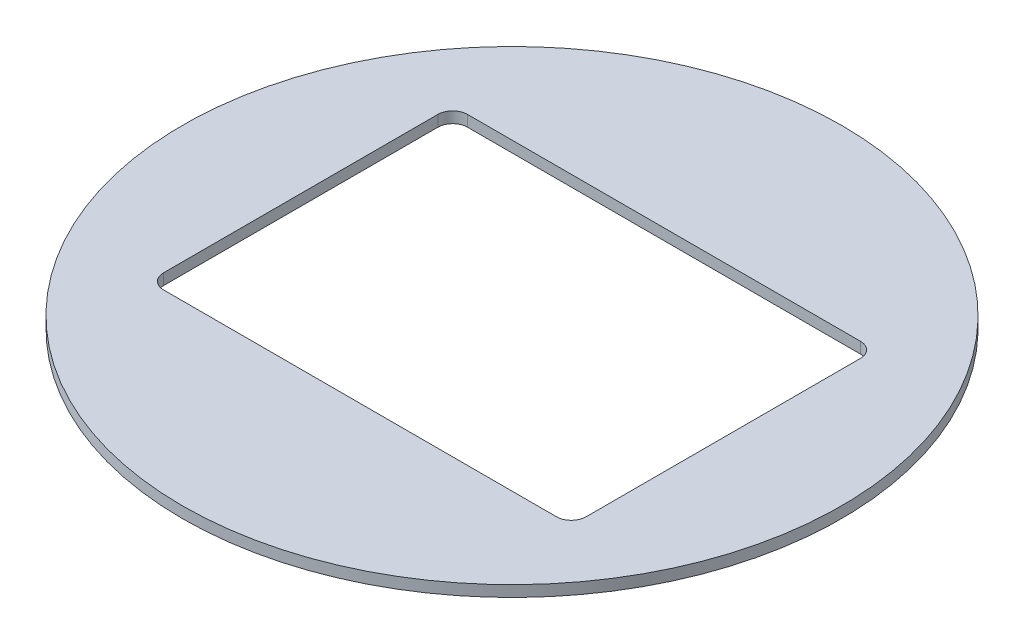
ISO-10303-21;
HEADER;
FILE_DESCRIPTION(('STEP AP214'),'2;1');
FILE_NAME('part.step','',(''),(''),'','','');
FILE_SCHEMA(('AUTOMOTIVE_DESIGN { 1 0 10303 214 1 1 1 1 }'));
ENDSEC;
DATA;
#1=APPLICATION_CONTEXT('core data for automotive mechanical design processes');
#2=APPLICATION_PROTOCOL_DEFINITION('international standard','automotive_design',2000,#1);
#3=PRODUCT_CONTEXT('',#1,'mechanical');
#4=PRODUCT('Part','Part','',(#3));
#5=PRODUCT_RELATED_PRODUCT_CATEGORY('part','',(#4));
#6=PRODUCT_DEFINITION_FORMATION('','',#4);
#7=PRODUCT_DEFINITION_CONTEXT('part definition',#1,'design');
#8=PRODUCT_DEFINITION('design','',#6,#7);
#9=PRODUCT_DEFINITION_SHAPE('','',#8);
#10=(LENGTH_UNIT() NAMED_UNIT(*) SI_UNIT(.MILLI.,.METRE.));
#11=(NAMED_UNIT(*) PLANE_ANGLE_UNIT() SI_UNIT($,.RADIAN.));
#12=(NAMED_UNIT(*) SI_UNIT($,.STERADIAN.) SOLID_ANGLE_UNIT());
#13=UNCERTAINTY_MEASURE_WITH_UNIT(LENGTH_MEASURE(1.E-05),#10,'distance_accuracy_value','');
#14=(GEOMETRIC_REPRESENTATION_CONTEXT(3) GLOBAL_UNCERTAINTY_ASSIGNED_CONTEXT((#13)) GLOBAL_UNIT_ASSIGNED_CONTEXT((#10,
#11,#12)) REPRESENTATION_CONTEXT('',''));
#15=CARTESIAN_POINT('',(0.,0.,0.));
#16=DIRECTION('',(0.,0.,1.));
#17=DIRECTION('',(1.,0.,0.));
#18=AXIS2_PLACEMENT_3D('',#15,#16,#17);
#19=CARTESIAN_POINT('',(0.,3.,0.));
#20=DIRECTION('',(0.,-1.,0.));
#21=DIRECTION('',(0.,0.,-1.));
#22=AXIS2_PLACEMENT_3D('',#19,#20,#21);
#23=CYLINDRICAL_SURFACE('',#22,88.9);
#24=CARTESIAN_POINT('',(0.,3.,0.));
#25=DIRECTION('',(0.,1.,0.));
#26=DIRECTION('',(0.,0.,1.));
#27=AXIS2_PLACEMENT_3D('',#24,#25,#26);
#28=CIRCLE('',#27,88.9);
#29=CARTESIAN_POINT('',(0.,3.,88.9));
#30=VERTEX_POINT('',#29);
#31=EDGE_CURVE('E11',#30,#30,#28,.T.);
#32=ORIENTED_EDGE('',*,*,#31,.F.);
#33=EDGE_LOOP('',(#32));
#34=FACE_BOUND('',#33,.T.);
#35=CARTESIAN_POINT('',(0.,0.,0.));
#36=DIRECTION('',(0.,1.,0.));
#37=DIRECTION('',(0.,0.,1.));
#38=AXIS2_PLACEMENT_3D('',#35,#36,#37);
#39=CIRCLE('',#38,88.9);
#40=CARTESIAN_POINT('',(0.,0.,88.9));
#41=VERTEX_POINT('',#40);
#42=EDGE_CURVE('E35',#41,#41,#39,.T.);
#43=ORIENTED_EDGE('',*,*,#42,.T.);
#44=EDGE_LOOP('',(#43));
#45=FACE_BOUND('',#44,.T.);
#46=ADVANCED_FACE('F32',(#34,#45),#23,.T.);
#47=CARTESIAN_POINT('',(0.,3.,0.));
#48=DIRECTION('',(0.,1.,0.));
#49=DIRECTION('',(0.,0.,1.));
#50=AXIS2_PLACEMENT_3D('',#47,#48,#49);
#51=PLANE('',#50);
#52=CARTESIAN_POINT('',(-53.,3.,37.));
#53=DIRECTION('',(0.,-1.,0.));
#54=DIRECTION('',(0.,0.,-1.));
#55=AXIS2_PLACEMENT_3D('',#52,#53,#54);
#56=CIRCLE('',#55,4.);
#57=CARTESIAN_POINT('',(-53.,3.,41.));
#58=VERTEX_POINT('',#57);
#59=CARTESIAN_POINT('',(-57.,3.,37.));
#60=VERTEX_POINT('',#59);
#61=EDGE_CURVE('E98',#58,#60,#56,.T.);
#62=ORIENTED_EDGE('',*,*,#61,.T.);
#63=DIRECTION('',(0.,0.,-1.));
#64=VECTOR('',#63,1.);
#65=CARTESIAN_POINT('',(-57.,3.,-37.));
#66=LINE('',#65,#64);
#67=CARTESIAN_POINT('',(-57.,3.,-37.));
#68=VERTEX_POINT('',#67);
#69=EDGE_CURVE('E107',#60,#68,#66,.T.);
#70=ORIENTED_EDGE('',*,*,#69,.T.);
#71=CARTESIAN_POINT('',(-53.,3.,-37.));
#72=DIRECTION('',(0.,-1.,0.));
#73=DIRECTION('',(0.,0.,1.));
#74=AXIS2_PLACEMENT_3D('',#71,#72,#73);
#75=CIRCLE('',#74,4.);
#76=CARTESIAN_POINT('',(-53.,3.,-41.));
#77=VERTEX_POINT('',#76);
#78=EDGE_CURVE('E46',#68,#77,#75,.T.);
#79=ORIENTED_EDGE('',*,*,#78,.T.);
#80=DIRECTION('',(1.,0.,0.));
#81=VECTOR('',#80,1.);
#82=CARTESIAN_POINT('',(53.,3.,-41.));
#83=LINE('',#82,#81);
#84=CARTESIAN_POINT('',(53.,3.,-41.));
#85=VERTEX_POINT('',#84);
#86=EDGE_CURVE('E122',#77,#85,#83,.T.);
#87=ORIENTED_EDGE('',*,*,#86,.T.);
#88=CARTESIAN_POINT('',(53.,3.,-37.));
#89=DIRECTION('',(0.,-1.,0.));
#90=DIRECTION('',(0.,0.,-1.));
#91=AXIS2_PLACEMENT_3D('',#88,#89,#90);
#92=CIRCLE('',#91,4.00000000000001);
#93=CARTESIAN_POINT('',(57.,3.,-37.));
#94=VERTEX_POINT('',#93);
#95=EDGE_CURVE('E125',#85,#94,#92,.T.);
#96=ORIENTED_EDGE('',*,*,#95,.T.);
#97=DIRECTION('',(0.,0.,1.));
#98=VECTOR('',#97,1.);
#99=CARTESIAN_POINT('',(57.,3.,-37.));
#100=LINE('',#99,#98);
#101=CARTESIAN_POINT('',(57.,3.,37.));
#102=VERTEX_POINT('',#101);
#103=EDGE_CURVE('E128',#94,#102,#100,.T.);
#104=ORIENTED_EDGE('',*,*,#103,.T.);
#105=CARTESIAN_POINT('',(53.,3.,37.));
#106=DIRECTION('',(0.,-1.,0.));
#107=DIRECTION('',(0.,0.,-1.));
#108=AXIS2_PLACEMENT_3D('',#105,#106,#107);
#109=CIRCLE('',#108,4.);
#110=CARTESIAN_POINT('',(53.,3.,41.));
#111=VERTEX_POINT('',#110);
#112=EDGE_CURVE('E131',#102,#111,#109,.T.);
#113=ORIENTED_EDGE('',*,*,#112,.T.);
#114=DIRECTION('',(-1.,0.,0.));
#115=VECTOR('',#114,1.);
#116=CARTESIAN_POINT('',(53.,3.,41.));
#117=LINE('',#116,#115);
#118=EDGE_CURVE('E104',#111,#58,#117,.T.);
#119=ORIENTED_EDGE('',*,*,#118,.T.);
#120=EDGE_LOOP('',(#62,#70,#79,#87,#96,#104,#113,#119));
#121=FACE_BOUND('',#120,.T.);
#122=ORIENTED_EDGE('',*,*,#31,.T.);
#123=EDGE_LOOP('',(#122));
#124=FACE_BOUND('',#123,.T.);
#125=ADVANCED_FACE('F111',(#121,#124),#51,.T.);
#126=CARTESIAN_POINT('',(0.,0.,0.));
#127=DIRECTION('',(0.,1.,0.));
#128=DIRECTION('',(0.,0.,1.));
#129=AXIS2_PLACEMENT_3D('',#126,#127,#128);
#130=PLANE('',#129);
#131=DIRECTION('',(0.,0.,-1.));
#132=VECTOR('',#131,1.);
#133=CARTESIAN_POINT('',(-57.,0.,-37.));
#134=LINE('',#133,#132);
#135=CARTESIAN_POINT('',(-57.,0.,37.));
#136=VERTEX_POINT('',#135);
#137=CARTESIAN_POINT('',(-57.,0.,-37.));
#138=VERTEX_POINT('',#137);
#139=EDGE_CURVE('E135',#136,#138,#134,.T.);
#140=ORIENTED_EDGE('',*,*,#139,.F.);
#141=CARTESIAN_POINT('',(-53.,0.,37.));
#142=DIRECTION('',(0.,-1.,0.));
#143=DIRECTION('',(0.,0.,-1.));
#144=AXIS2_PLACEMENT_3D('',#141,#142,#143);
#145=CIRCLE('',#144,4.);
#146=CARTESIAN_POINT('',(-53.,0.,41.));
#147=VERTEX_POINT('',#146);
#148=EDGE_CURVE('E54',#147,#136,#145,.T.);
#149=ORIENTED_EDGE('',*,*,#148,.F.);
#150=DIRECTION('',(-1.,0.,0.));
#151=VECTOR('',#150,1.);
#152=CARTESIAN_POINT('',(53.,0.,41.));
#153=LINE('',#152,#151);
#154=CARTESIAN_POINT('',(53.,0.,41.));
#155=VERTEX_POINT('',#154);
#156=EDGE_CURVE('E115',#155,#147,#153,.T.);
#157=ORIENTED_EDGE('',*,*,#156,.F.);
#158=CARTESIAN_POINT('',(53.,0.,37.));
#159=DIRECTION('',(0.,-1.,0.));
#160=DIRECTION('',(0.,0.,-1.));
#161=AXIS2_PLACEMENT_3D('',#158,#159,#160);
#162=CIRCLE('',#161,4.);
#163=CARTESIAN_POINT('',(57.,0.,37.));
#164=VERTEX_POINT('',#163);
#165=EDGE_CURVE('E118',#164,#155,#162,.T.);
#166=ORIENTED_EDGE('',*,*,#165,.F.);
#167=DIRECTION('',(0.,0.,1.));
#168=VECTOR('',#167,1.);
#169=CARTESIAN_POINT('',(57.,0.,-37.));
#170=LINE('',#169,#168);
#171=CARTESIAN_POINT('',(57.,0.,-37.));
#172=VERTEX_POINT('',#171);
#173=EDGE_CURVE('E146',#172,#164,#170,.T.);
#174=ORIENTED_EDGE('',*,*,#173,.F.);
#175=CARTESIAN_POINT('',(53.,0.,-37.));
#176=DIRECTION('',(0.,-1.,0.));
#177=DIRECTION('',(0.,0.,-1.));
#178=AXIS2_PLACEMENT_3D('',#175,#176,#177);
#179=CIRCLE('',#178,4.00000000000001);
#180=CARTESIAN_POINT('',(53.,0.,-41.));
#181=VERTEX_POINT('',#180);
#182=EDGE_CURVE('E143',#181,#172,#179,.T.);
#183=ORIENTED_EDGE('',*,*,#182,.F.);
#184=DIRECTION('',(1.,0.,0.));
#185=VECTOR('',#184,1.);
#186=CARTESIAN_POINT('',(53.,0.,-41.));
#187=LINE('',#186,#185);
#188=CARTESIAN_POINT('',(-53.,0.,-41.));
#189=VERTEX_POINT('',#188);
#190=EDGE_CURVE('E140',#189,#181,#187,.T.);
#191=ORIENTED_EDGE('',*,*,#190,.F.);
#192=CARTESIAN_POINT('',(-53.,0.,-37.));
#193=DIRECTION('',(0.,-1.,0.));
#194=DIRECTION('',(0.,0.,1.));
#195=AXIS2_PLACEMENT_3D('',#192,#193,#194);
#196=CIRCLE('',#195,4.);
#197=EDGE_CURVE('E137',#138,#189,#196,.T.);
#198=ORIENTED_EDGE('',*,*,#197,.F.);
#199=EDGE_LOOP('',(#140,#149,#157,#166,#174,#183,#191,#198));
#200=FACE_BOUND('',#199,.T.);
#201=ORIENTED_EDGE('',*,*,#42,.F.);
#202=EDGE_LOOP('',(#201));
#203=FACE_BOUND('',#202,.T.);
#204=ADVANCED_FACE('F167',(#200,#203),#130,.F.);
#205=CARTESIAN_POINT('',(-53.,3.,37.));
#206=DIRECTION('',(0.,-1.,0.));
#207=DIRECTION('',(0.,0.,-1.));
#208=AXIS2_PLACEMENT_3D('',#205,#206,#207);
#209=CYLINDRICAL_SURFACE('',#208,4.);
#210=ORIENTED_EDGE('',*,*,#148,.T.);
#211=DIRECTION('',(0.,-1.,0.));
#212=VECTOR('',#211,1.);
#213=CARTESIAN_POINT('',(-57.,3.,37.));
#214=LINE('',#213,#212);
#215=EDGE_CURVE('E94',#60,#136,#214,.T.);
#216=ORIENTED_EDGE('',*,*,#215,.F.);
#217=ORIENTED_EDGE('',*,*,#61,.F.);
#218=DIRECTION('',(0.,-1.,0.));
#219=VECTOR('',#218,1.);
#220=CARTESIAN_POINT('',(-53.,3.,41.));
#221=LINE('',#220,#219);
#222=EDGE_CURVE('E151',#58,#147,#221,.T.);
#223=ORIENTED_EDGE('',*,*,#222,.T.);
#224=EDGE_LOOP('',(#210,#216,#217,#223));
#225=FACE_BOUND('',#224,.T.);
#226=ADVANCED_FACE('F96',(#225),#209,.F.);
#227=CARTESIAN_POINT('',(53.,3.,41.));
#228=DIRECTION('',(0.,0.,1.));
#229=DIRECTION('',(1.,0.,0.));
#230=AXIS2_PLACEMENT_3D('',#227,#228,#229);
#231=PLANE('',#230);
#232=ORIENTED_EDGE('',*,*,#156,.T.);
#233=ORIENTED_EDGE('',*,*,#222,.F.);
#234=ORIENTED_EDGE('',*,*,#118,.F.);
#235=DIRECTION('',(0.,-1.,0.));
#236=VECTOR('',#235,1.);
#237=CARTESIAN_POINT('',(53.,3.,41.));
#238=LINE('',#237,#236);
#239=EDGE_CURVE('E153',#111,#155,#238,.T.);
#240=ORIENTED_EDGE('',*,*,#239,.T.);
#241=EDGE_LOOP('',(#232,#233,#234,#240));
#242=FACE_BOUND('',#241,.T.);
#243=ADVANCED_FACE('F186',(#242),#231,.F.);
#244=CARTESIAN_POINT('',(53.,3.,37.));
#245=DIRECTION('',(0.,-1.,0.));
#246=DIRECTION('',(0.,0.,-1.));
#247=AXIS2_PLACEMENT_3D('',#244,#245,#246);
#248=CYLINDRICAL_SURFACE('',#247,4.);
#249=ORIENTED_EDGE('',*,*,#165,.T.);
#250=ORIENTED_EDGE('',*,*,#239,.F.);
#251=ORIENTED_EDGE('',*,*,#112,.F.);
#252=DIRECTION('',(0.,-1.,0.));
#253=VECTOR('',#252,1.);
#254=CARTESIAN_POINT('',(57.,3.,37.));
#255=LINE('',#254,#253);
#256=EDGE_CURVE('E155',#102,#164,#255,.T.);
#257=ORIENTED_EDGE('',*,*,#256,.T.);
#258=EDGE_LOOP('',(#249,#250,#251,#257));
#259=FACE_BOUND('',#258,.T.);
#260=ADVANCED_FACE('F183',(#259),#248,.F.);
#261=CARTESIAN_POINT('',(57.,3.,-37.));
#262=DIRECTION('',(1.,0.,0.));
#263=DIRECTION('',(0.,0.,-1.));
#264=AXIS2_PLACEMENT_3D('',#261,#262,#263);
#265=PLANE('',#264);
#266=ORIENTED_EDGE('',*,*,#173,.T.);
#267=ORIENTED_EDGE('',*,*,#256,.F.);
#268=ORIENTED_EDGE('',*,*,#103,.F.);
#269=DIRECTION('',(0.,-1.,0.));
#270=VECTOR('',#269,1.);
#271=CARTESIAN_POINT('',(57.,3.,-37.));
#272=LINE('',#271,#270);
#273=EDGE_CURVE('E157',#94,#172,#272,.T.);
#274=ORIENTED_EDGE('',*,*,#273,.T.);
#275=EDGE_LOOP('',(#266,#267,#268,#274));
#276=FACE_BOUND('',#275,.T.);
#277=ADVANCED_FACE('F179',(#276),#265,.F.);
#278=CARTESIAN_POINT('',(53.,3.,-37.));
#279=DIRECTION('',(0.,-1.,0.));
#280=DIRECTION('',(0.,0.,-1.));
#281=AXIS2_PLACEMENT_3D('',#278,#279,#280);
#282=CYLINDRICAL_SURFACE('',#281,4.00000000000001);
#283=ORIENTED_EDGE('',*,*,#182,.T.);
#284=ORIENTED_EDGE('',*,*,#273,.F.);
#285=ORIENTED_EDGE('',*,*,#95,.F.);
#286=DIRECTION('',(0.,-1.,0.));
#287=VECTOR('',#286,1.);
#288=CARTESIAN_POINT('',(53.,3.,-41.));
#289=LINE('',#288,#287);
#290=EDGE_CURVE('E159',#85,#181,#289,.T.);
#291=ORIENTED_EDGE('',*,*,#290,.T.);
#292=EDGE_LOOP('',(#283,#284,#285,#291));
#293=FACE_BOUND('',#292,.T.);
#294=ADVANCED_FACE('F177',(#293),#282,.F.);
#295=CARTESIAN_POINT('',(53.,3.,-41.));
#296=DIRECTION('',(0.,0.,-1.));
#297=DIRECTION('',(-1.,0.,0.));
#298=AXIS2_PLACEMENT_3D('',#295,#296,#297);
#299=PLANE('',#298);
#300=ORIENTED_EDGE('',*,*,#190,.T.);
#301=ORIENTED_EDGE('',*,*,#290,.F.);
#302=ORIENTED_EDGE('',*,*,#86,.F.);
#303=DIRECTION('',(0.,-1.,0.));
#304=VECTOR('',#303,1.);
#305=CARTESIAN_POINT('',(-53.,3.,-41.));
#306=LINE('',#305,#304);
#307=EDGE_CURVE('E161',#77,#189,#306,.T.);
#308=ORIENTED_EDGE('',*,*,#307,.T.);
#309=EDGE_LOOP('',(#300,#301,#302,#308));
#310=FACE_BOUND('',#309,.T.);
#311=ADVANCED_FACE('F172',(#310),#299,.F.);
#312=CARTESIAN_POINT('',(-53.,3.,-37.));
#313=DIRECTION('',(0.,-1.,0.));
#314=DIRECTION('',(0.,0.,-1.));
#315=AXIS2_PLACEMENT_3D('',#312,#313,#314);
#316=CYLINDRICAL_SURFACE('',#315,4.);
#317=ORIENTED_EDGE('',*,*,#197,.T.);
#318=ORIENTED_EDGE('',*,*,#307,.F.);
#319=ORIENTED_EDGE('',*,*,#78,.F.);
#320=DIRECTION('',(0.,-1.,0.));
#321=VECTOR('',#320,1.);
#322=CARTESIAN_POINT('',(-57.,3.,-37.));
#323=LINE('',#322,#321);
#324=EDGE_CURVE('E103',#68,#138,#323,.T.);
#325=ORIENTED_EDGE('',*,*,#324,.T.);
#326=EDGE_LOOP('',(#317,#318,#319,#325));
#327=FACE_BOUND('',#326,.T.);
#328=ADVANCED_FACE('F163',(#327),#316,.F.);
#329=CARTESIAN_POINT('',(-57.,3.,-37.));
#330=DIRECTION('',(-1.,0.,0.));
#331=DIRECTION('',(0.,0.,1.));
#332=AXIS2_PLACEMENT_3D('',#329,#330,#331);
#333=PLANE('',#332);
#334=ORIENTED_EDGE('',*,*,#139,.T.);
#335=ORIENTED_EDGE('',*,*,#324,.F.);
#336=ORIENTED_EDGE('',*,*,#69,.F.);
#337=ORIENTED_EDGE('',*,*,#215,.T.);
#338=EDGE_LOOP('',(#334,#335,#336,#337));
#339=FACE_BOUND('',#338,.T.);
#340=ADVANCED_FACE('F108',(#339),#333,.F.);
#341=CLOSED_SHELL('',(#46,#125,#204,#226,#243,#260,#277,#294,#311,#328,#340));
#342=MANIFOLD_SOLID_BREP('B2',#341);
#343=ADVANCED_BREP_SHAPE_REPRESENTATION('',(#18,#342),#14);
#344=SHAPE_DEFINITION_REPRESENTATION(#9,#343);
ENDSEC;
END-ISO-10303-21;
